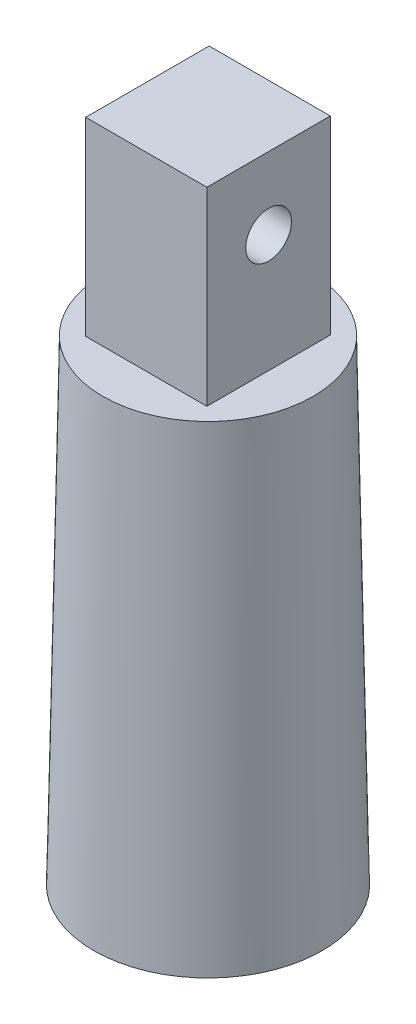
ISO-10303-21;
HEADER;
FILE_DESCRIPTION(('STEP AP214'),'2;1');
FILE_NAME('part.step','',(''),(''),'','','');
FILE_SCHEMA(('AUTOMOTIVE_DESIGN { 1 0 10303 214 1 1 1 1 }'));
ENDSEC;
DATA;
#1=APPLICATION_CONTEXT('core data for automotive mechanical design processes');
#2=APPLICATION_PROTOCOL_DEFINITION('international standard','automotive_design',2000,#1);
#3=PRODUCT_CONTEXT('',#1,'mechanical');
#4=PRODUCT('Part','Part','',(#3));
#5=PRODUCT_RELATED_PRODUCT_CATEGORY('part','',(#4));
#6=PRODUCT_DEFINITION_FORMATION('','',#4);
#7=PRODUCT_DEFINITION_CONTEXT('part definition',#1,'design');
#8=PRODUCT_DEFINITION('design','',#6,#7);
#9=PRODUCT_DEFINITION_SHAPE('','',#8);
#10=(LENGTH_UNIT() NAMED_UNIT(*) SI_UNIT(.MILLI.,.METRE.));
#11=(NAMED_UNIT(*) PLANE_ANGLE_UNIT() SI_UNIT($,.RADIAN.));
#12=(NAMED_UNIT(*) SI_UNIT($,.STERADIAN.) SOLID_ANGLE_UNIT());
#13=UNCERTAINTY_MEASURE_WITH_UNIT(LENGTH_MEASURE(1.E-05),#10,'distance_accuracy_value','');
#14=(GEOMETRIC_REPRESENTATION_CONTEXT(3) GLOBAL_UNCERTAINTY_ASSIGNED_CONTEXT((#13)) GLOBAL_UNIT_ASSIGNED_CONTEXT((#10,
#11,#12)) REPRESENTATION_CONTEXT('',''));
#15=CARTESIAN_POINT('',(0.,0.,0.));
#16=DIRECTION('',(0.,0.,1.));
#17=DIRECTION('',(1.,0.,0.));
#18=AXIS2_PLACEMENT_3D('',#15,#16,#17);
#19=CARTESIAN_POINT('',(0.,20.8,0.));
#20=DIRECTION('',(0.,1.,0.));
#21=DIRECTION('',(0.,0.,1.));
#22=AXIS2_PLACEMENT_3D('',#19,#20,#21);
#23=PLANE('',#22);
#24=DIRECTION('',(0.,0.,1.));
#25=VECTOR('',#24,1.);
#26=CARTESIAN_POINT('',(-2.65,20.8,-2.7));
#27=LINE('',#26,#25);
#28=CARTESIAN_POINT('',(-2.65,20.8,-2.7));
#29=VERTEX_POINT('',#28);
#30=CARTESIAN_POINT('',(-2.65,20.8,2.7));
#31=VERTEX_POINT('',#30);
#32=EDGE_CURVE('E53',#29,#31,#27,.T.);
#33=ORIENTED_EDGE('',*,*,#32,.F.);
#34=DIRECTION('',(-1.,0.,0.));
#35=VECTOR('',#34,1.);
#36=CARTESIAN_POINT('',(-2.65,20.8,-2.7));
#37=LINE('',#36,#35);
#38=CARTESIAN_POINT('',(2.65,20.8,-2.7));
#39=VERTEX_POINT('',#38);
#40=EDGE_CURVE('E57',#39,#29,#37,.T.);
#41=ORIENTED_EDGE('',*,*,#40,.F.);
#42=DIRECTION('',(0.,0.,-1.));
#43=VECTOR('',#42,1.);
#44=CARTESIAN_POINT('',(2.65,20.8,-2.7));
#45=LINE('',#44,#43);
#46=CARTESIAN_POINT('',(2.65,20.8,2.7));
#47=VERTEX_POINT('',#46);
#48=EDGE_CURVE('E246',#47,#39,#45,.T.);
#49=ORIENTED_EDGE('',*,*,#48,.F.);
#50=DIRECTION('',(1.,0.,0.));
#51=VECTOR('',#50,1.);
#52=CARTESIAN_POINT('',(-2.65,20.8,2.7));
#53=LINE('',#52,#51);
#54=EDGE_CURVE('E238',#31,#47,#53,.T.);
#55=ORIENTED_EDGE('',*,*,#54,.F.);
#56=EDGE_LOOP('',(#33,#41,#49,#55));
#57=FACE_BOUND('',#56,.T.);
#58=CARTESIAN_POINT('',(0.,20.8,0.));
#59=DIRECTION('',(0.,1.,0.));
#60=DIRECTION('',(0.,0.,1.));
#61=AXIS2_PLACEMENT_3D('',#58,#59,#60);
#62=CIRCLE('',#61,4.6);
#63=CARTESIAN_POINT('',(0.,20.8,4.6));
#64=VERTEX_POINT('',#63);
#65=EDGE_CURVE('E12',#64,#64,#62,.T.);
#66=ORIENTED_EDGE('',*,*,#65,.T.);
#67=EDGE_LOOP('',(#66));
#68=FACE_BOUND('',#67,.T.);
#69=ADVANCED_FACE('F36',(#57,#68),#23,.T.);
#70=CARTESIAN_POINT('',(0.,0.,0.));
#71=DIRECTION('',(0.,1.,0.));
#72=DIRECTION('',(0.,0.,1.));
#73=AXIS2_PLACEMENT_3D('',#70,#71,#72);
#74=PLANE('',#73);
#75=CARTESIAN_POINT('',(0.,0.,0.));
#76=DIRECTION('',(0.,1.,0.));
#77=DIRECTION('',(0.,0.,1.));
#78=AXIS2_PLACEMENT_3D('',#75,#76,#77);
#79=CIRCLE('',#78,5.);
#80=CARTESIAN_POINT('',(0.,0.,5.));
#81=VERTEX_POINT('',#80);
#82=EDGE_CURVE('E45',#81,#81,#79,.T.);
#83=ORIENTED_EDGE('',*,*,#82,.F.);
#84=EDGE_LOOP('',(#83));
#85=FACE_BOUND('',#84,.T.);
#86=ADVANCED_FACE('F123',(#85),#74,.F.);
#87=CARTESIAN_POINT('',(0.,20.8,0.));
#88=DIRECTION('',(0.,-1.,0.));
#89=DIRECTION('',(0.,0.,-1.));
#90=AXIS2_PLACEMENT_3D('',#87,#88,#89);
#91=CONICAL_SURFACE('',#90,4.6,0.0192283990997072);
#92=ORIENTED_EDGE('',*,*,#82,.T.);
#93=EDGE_LOOP('',(#92));
#94=FACE_BOUND('',#93,.T.);
#95=ORIENTED_EDGE('',*,*,#65,.F.);
#96=EDGE_LOOP('',(#95));
#97=FACE_BOUND('',#96,.T.);
#98=ADVANCED_FACE('F114',(#94,#97),#91,.T.);
#99=CARTESIAN_POINT('',(-2.65,29.1,-2.7));
#100=DIRECTION('',(1.,0.,0.));
#101=DIRECTION('',(0.,0.,-1.));
#102=AXIS2_PLACEMENT_3D('',#99,#100,#101);
#103=PLANE('',#102);
#104=CARTESIAN_POINT('',(-2.65,25.95,0.));
#105=DIRECTION('',(-1.,0.,0.));
#106=DIRECTION('',(0.,0.,1.));
#107=AXIS2_PLACEMENT_3D('',#104,#105,#106);
#108=CIRCLE('',#107,1.);
#109=CARTESIAN_POINT('',(-2.65,25.95,1.));
#110=VERTEX_POINT('',#109);
#111=EDGE_CURVE('E235',#110,#110,#108,.T.);
#112=ORIENTED_EDGE('',*,*,#111,.F.);
#113=EDGE_LOOP('',(#112));
#114=FACE_BOUND('',#113,.T.);
#115=ORIENTED_EDGE('',*,*,#32,.T.);
#116=DIRECTION('',(0.,-1.,0.));
#117=VECTOR('',#116,1.);
#118=CARTESIAN_POINT('',(-2.65,29.1,2.7));
#119=LINE('',#118,#117);
#120=CARTESIAN_POINT('',(-2.65,29.1,2.7));
#121=VERTEX_POINT('',#120);
#122=EDGE_CURVE('E82',#121,#31,#119,.T.);
#123=ORIENTED_EDGE('',*,*,#122,.F.);
#124=DIRECTION('',(0.,0.,1.));
#125=VECTOR('',#124,1.);
#126=CARTESIAN_POINT('',(-2.65,29.1,-2.7));
#127=LINE('',#126,#125);
#128=CARTESIAN_POINT('',(-2.65,29.1,-2.7));
#129=VERTEX_POINT('',#128);
#130=EDGE_CURVE('E88',#129,#121,#127,.T.);
#131=ORIENTED_EDGE('',*,*,#130,.F.);
#132=DIRECTION('',(0.,-1.,0.));
#133=VECTOR('',#132,1.);
#134=CARTESIAN_POINT('',(-2.65,29.1,-2.7));
#135=LINE('',#134,#133);
#136=EDGE_CURVE('E243',#129,#29,#135,.T.);
#137=ORIENTED_EDGE('',*,*,#136,.T.);
#138=EDGE_LOOP('',(#115,#123,#131,#137));
#139=FACE_BOUND('',#138,.T.);
#140=ADVANCED_FACE('F98',(#114,#139),#103,.F.);
#141=CARTESIAN_POINT('',(-2.65,29.1,2.7));
#142=DIRECTION('',(0.,0.,-1.));
#143=DIRECTION('',(-1.,0.,0.));
#144=AXIS2_PLACEMENT_3D('',#141,#142,#143);
#145=PLANE('',#144);
#146=ORIENTED_EDGE('',*,*,#54,.T.);
#147=DIRECTION('',(0.,-1.,0.));
#148=VECTOR('',#147,1.);
#149=CARTESIAN_POINT('',(2.65,29.1,2.7));
#150=LINE('',#149,#148);
#151=CARTESIAN_POINT('',(2.65,29.1,2.7));
#152=VERTEX_POINT('',#151);
#153=EDGE_CURVE('E84',#152,#47,#150,.T.);
#154=ORIENTED_EDGE('',*,*,#153,.F.);
#155=DIRECTION('',(1.,0.,0.));
#156=VECTOR('',#155,1.);
#157=CARTESIAN_POINT('',(-2.65,29.1,2.7));
#158=LINE('',#157,#156);
#159=EDGE_CURVE('E77',#121,#152,#158,.T.);
#160=ORIENTED_EDGE('',*,*,#159,.F.);
#161=ORIENTED_EDGE('',*,*,#122,.T.);
#162=EDGE_LOOP('',(#146,#154,#160,#161));
#163=FACE_BOUND('',#162,.T.);
#164=ADVANCED_FACE('F80',(#163),#145,.F.);
#165=CARTESIAN_POINT('',(2.65,29.1,-2.7));
#166=DIRECTION('',(-1.,0.,0.));
#167=DIRECTION('',(0.,0.,1.));
#168=AXIS2_PLACEMENT_3D('',#165,#166,#167);
#169=PLANE('',#168);
#170=CARTESIAN_POINT('',(2.65,25.95,0.));
#171=DIRECTION('',(-1.,0.,0.));
#172=DIRECTION('',(0.,0.,1.));
#173=AXIS2_PLACEMENT_3D('',#170,#171,#172);
#174=CIRCLE('',#173,1.);
#175=CARTESIAN_POINT('',(2.65,25.95,1.));
#176=VERTEX_POINT('',#175);
#177=EDGE_CURVE('E40',#176,#176,#174,.T.);
#178=ORIENTED_EDGE('',*,*,#177,.T.);
#179=EDGE_LOOP('',(#178));
#180=FACE_BOUND('',#179,.T.);
#181=ORIENTED_EDGE('',*,*,#48,.T.);
#182=DIRECTION('',(0.,-1.,0.));
#183=VECTOR('',#182,1.);
#184=CARTESIAN_POINT('',(2.65,29.1,-2.7));
#185=LINE('',#184,#183);
#186=CARTESIAN_POINT('',(2.65,29.1,-2.7));
#187=VERTEX_POINT('',#186);
#188=EDGE_CURVE('E102',#187,#39,#185,.T.);
#189=ORIENTED_EDGE('',*,*,#188,.F.);
#190=DIRECTION('',(0.,0.,-1.));
#191=VECTOR('',#190,1.);
#192=CARTESIAN_POINT('',(2.65,29.1,-2.7));
#193=LINE('',#192,#191);
#194=EDGE_CURVE('E87',#152,#187,#193,.T.);
#195=ORIENTED_EDGE('',*,*,#194,.F.);
#196=ORIENTED_EDGE('',*,*,#153,.T.);
#197=EDGE_LOOP('',(#181,#189,#195,#196));
#198=FACE_BOUND('',#197,.T.);
#199=ADVANCED_FACE('F182',(#180,#198),#169,.F.);
#200=CARTESIAN_POINT('',(-2.65,29.1,-2.7));
#201=DIRECTION('',(0.,0.,1.));
#202=DIRECTION('',(1.,0.,0.));
#203=AXIS2_PLACEMENT_3D('',#200,#201,#202);
#204=PLANE('',#203);
#205=ORIENTED_EDGE('',*,*,#40,.T.);
#206=ORIENTED_EDGE('',*,*,#136,.F.);
#207=DIRECTION('',(-1.,0.,0.));
#208=VECTOR('',#207,1.);
#209=CARTESIAN_POINT('',(-2.65,29.1,-2.7));
#210=LINE('',#209,#208);
#211=EDGE_CURVE('E93',#187,#129,#210,.T.);
#212=ORIENTED_EDGE('',*,*,#211,.F.);
#213=ORIENTED_EDGE('',*,*,#188,.T.);
#214=EDGE_LOOP('',(#205,#206,#212,#213));
#215=FACE_BOUND('',#214,.T.);
#216=ADVANCED_FACE('F189',(#215),#204,.F.);
#217=CARTESIAN_POINT('',(0.,29.1,0.));
#218=DIRECTION('',(0.,1.,0.));
#219=DIRECTION('',(0.,0.,1.));
#220=AXIS2_PLACEMENT_3D('',#217,#218,#219);
#221=PLANE('',#220);
#222=ORIENTED_EDGE('',*,*,#130,.T.);
#223=ORIENTED_EDGE('',*,*,#159,.T.);
#224=ORIENTED_EDGE('',*,*,#194,.T.);
#225=ORIENTED_EDGE('',*,*,#211,.T.);
#226=EDGE_LOOP('',(#222,#223,#224,#225));
#227=FACE_BOUND('',#226,.T.);
#228=ADVANCED_FACE('F91',(#227),#221,.T.);
#229=CARTESIAN_POINT('',(5.0001,25.95,0.));
#230=DIRECTION('',(-1.,0.,0.));
#231=DIRECTION('',(0.,0.,1.));
#232=AXIS2_PLACEMENT_3D('',#229,#230,#231);
#233=CYLINDRICAL_SURFACE('',#232,1.);
#234=CARTESIAN_POINT('',(-2.65,25.95,1.));
#235=CARTESIAN_POINT('',(-2.59479166666667,25.95,1.));
#236=CARTESIAN_POINT('',(-2.53958333333333,25.95,1.));
#237=CARTESIAN_POINT('',(-2.42916666666667,25.95,1.));
#238=CARTESIAN_POINT('',(-2.37395833333333,25.95,1.));
#239=CARTESIAN_POINT('',(-2.26354166666667,25.95,1.));
#240=CARTESIAN_POINT('',(-2.20833333333333,25.95,1.));
#241=CARTESIAN_POINT('',(-2.09791666666667,25.95,1.));
#242=CARTESIAN_POINT('',(-2.04270833333333,25.95,1.));
#243=CARTESIAN_POINT('',(-1.93229166666667,25.95,1.));
#244=CARTESIAN_POINT('',(-1.87708333333333,25.95,1.));
#245=CARTESIAN_POINT('',(-1.76666666666667,25.95,1.));
#246=CARTESIAN_POINT('',(-1.71145833333333,25.95,1.));
#247=CARTESIAN_POINT('',(-1.60104166666667,25.95,1.));
#248=CARTESIAN_POINT('',(-1.54583333333333,25.95,1.));
#249=CARTESIAN_POINT('',(-1.43541666666667,25.95,1.));
#250=CARTESIAN_POINT('',(-1.38020833333333,25.95,1.));
#251=CARTESIAN_POINT('',(-1.26979166666667,25.95,1.));
#252=CARTESIAN_POINT('',(-1.21458333333333,25.95,1.));
#253=CARTESIAN_POINT('',(-1.10416666666667,25.95,1.));
#254=CARTESIAN_POINT('',(-1.04895833333333,25.95,1.));
#255=CARTESIAN_POINT('',(-0.938541666666667,25.95,1.));
#256=CARTESIAN_POINT('',(-0.883333333333334,25.95,1.));
#257=CARTESIAN_POINT('',(-0.772916666666667,25.95,1.));
#258=CARTESIAN_POINT('',(-0.717708333333333,25.95,1.));
#259=CARTESIAN_POINT('',(-0.607291666666667,25.95,1.));
#260=CARTESIAN_POINT('',(-0.552083333333333,25.95,1.));
#261=CARTESIAN_POINT('',(-0.441666666666667,25.95,1.));
#262=CARTESIAN_POINT('',(-0.386458333333333,25.95,1.));
#263=CARTESIAN_POINT('',(-0.276041666666667,25.95,1.));
#264=CARTESIAN_POINT('',(-0.220833333333333,25.95,1.));
#265=CARTESIAN_POINT('',(-0.110416666666667,25.95,1.));
#266=CARTESIAN_POINT('',(-0.0552083333333333,25.95,1.));
#267=CARTESIAN_POINT('',(0.0552083333333333,25.95,1.));
#268=CARTESIAN_POINT('',(0.110416666666667,25.95,1.));
#269=CARTESIAN_POINT('',(0.220833333333333,25.95,1.));
#270=CARTESIAN_POINT('',(0.276041666666667,25.95,1.));
#271=CARTESIAN_POINT('',(0.386458333333333,25.95,1.));
#272=CARTESIAN_POINT('',(0.441666666666667,25.95,1.));
#273=CARTESIAN_POINT('',(0.552083333333333,25.95,1.));
#274=CARTESIAN_POINT('',(0.607291666666667,25.95,1.));
#275=CARTESIAN_POINT('',(0.717708333333333,25.95,1.));
#276=CARTESIAN_POINT('',(0.772916666666667,25.95,1.));
#277=CARTESIAN_POINT('',(0.883333333333334,25.95,1.));
#278=CARTESIAN_POINT('',(0.938541666666667,25.95,1.));
#279=CARTESIAN_POINT('',(1.04895833333333,25.95,1.));
#280=CARTESIAN_POINT('',(1.10416666666667,25.95,1.));
#281=CARTESIAN_POINT('',(1.21458333333333,25.95,1.));
#282=CARTESIAN_POINT('',(1.26979166666667,25.95,1.));
#283=CARTESIAN_POINT('',(1.38020833333333,25.95,1.));
#284=CARTESIAN_POINT('',(1.43541666666667,25.95,1.));
#285=CARTESIAN_POINT('',(1.54583333333333,25.95,1.));
#286=CARTESIAN_POINT('',(1.60104166666667,25.95,1.));
#287=CARTESIAN_POINT('',(1.71145833333333,25.95,1.));
#288=CARTESIAN_POINT('',(1.76666666666667,25.95,1.));
#289=CARTESIAN_POINT('',(1.87708333333333,25.95,1.));
#290=CARTESIAN_POINT('',(1.93229166666667,25.95,1.));
#291=CARTESIAN_POINT('',(2.04270833333333,25.95,1.));
#292=CARTESIAN_POINT('',(2.09791666666667,25.95,1.));
#293=CARTESIAN_POINT('',(2.20833333333333,25.95,1.));
#294=CARTESIAN_POINT('',(2.26354166666667,25.95,1.));
#295=CARTESIAN_POINT('',(2.37395833333333,25.95,1.));
#296=CARTESIAN_POINT('',(2.42916666666667,25.95,1.));
#297=CARTESIAN_POINT('',(2.53958333333333,25.95,1.));
#298=CARTESIAN_POINT('',(2.59479166666667,25.95,1.));
#299=CARTESIAN_POINT('',(2.65,25.95,1.));
#300=B_SPLINE_CURVE_WITH_KNOTS('',3,(#234,#235,#236,#237,#238,#239,#240,#241,#242,#243,#244,
#245,#246,#247,#248,#249,#250,#251,#252,#253,#254,#255,#256,#257,#258,#259,#260,#261,#262,#263,
#264,#265,#266,#267,#268,#269,#270,#271,#272,#273,#274,#275,#276,#277,#278,#279,#280,#281,#282,
#283,#284,#285,#286,#287,#288,#289,#290,#291,#292,#293,#294,#295,#296,#297,#298,#299),
.UNSPECIFIED.,.F.,.F.,(4,2,2,2,2,2,2,2,2,2,2,2,2,2,2,2,2,2,2,2,2,2,2,2,2,2,2,2,2,2,2,2,4),(0.,
0.165625,0.33125,0.496875,0.6625,0.828125,0.99375,1.159375,1.325,1.490625,1.65625,1.821875,
1.9875,2.153125,2.31875,2.484375,2.65,2.815625,2.98125,3.146875,3.3125,3.478125,3.64375,
3.809375,3.975,4.140625,4.30625,4.471875,4.6375,4.803125,4.96875,5.134375,5.3),.UNSPECIFIED.);
#301=EDGE_CURVE('BSEAM203',#110,#176,#300,.T.);
#302=ORIENTED_EDGE('',*,*,#111,.T.);
#303=ORIENTED_EDGE('',*,*,#177,.F.);
#304=ORIENTED_EDGE('',*,*,#301,.T.);
#305=ORIENTED_EDGE('',*,*,#301,.F.);
#306=EDGE_LOOP('',(#302,#304,#303,#305));
#307=FACE_BOUND('',#306,.T.);
#308=ADVANCED_FACE('F203',(#307),#233,.F.);
#309=CLOSED_SHELL('',(#69,#86,#98,#140,#164,#199,#216,#228,#308));
#310=MANIFOLD_SOLID_BREP('B2',#309);
#311=ADVANCED_BREP_SHAPE_REPRESENTATION('',(#18,#310),#14);
#312=SHAPE_DEFINITION_REPRESENTATION(#9,#311);
ENDSEC;
END-ISO-10303-21;
